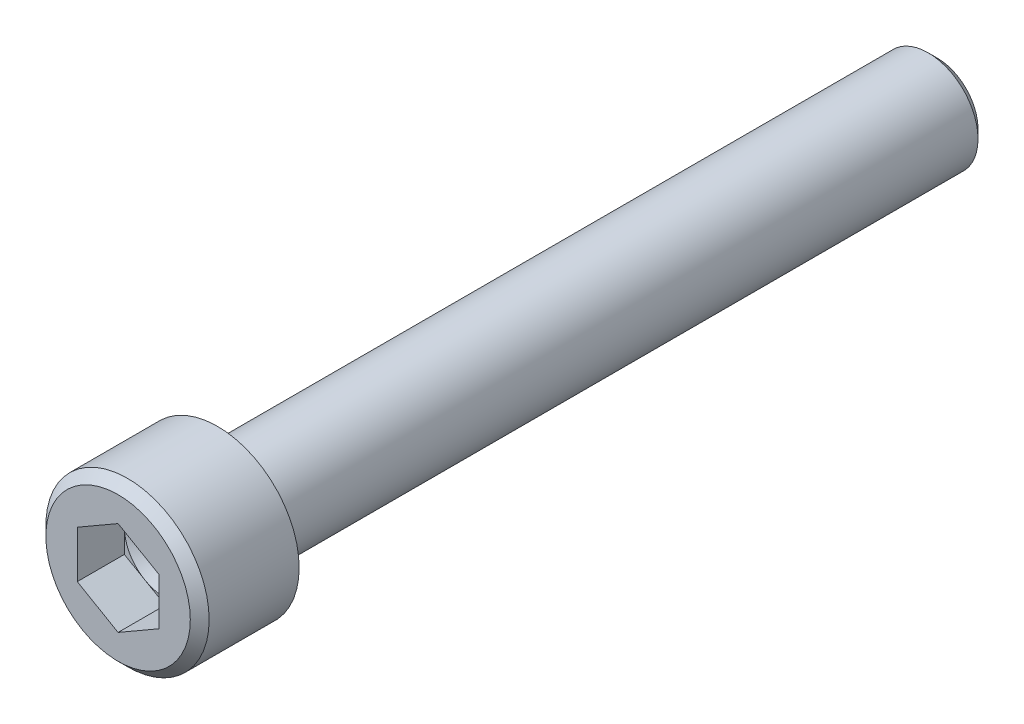
ISO-10303-21;
HEADER;
FILE_DESCRIPTION(('STEP AP214'),'2;1');
FILE_NAME('part.step','',(''),(''),'','','');
FILE_SCHEMA(('AUTOMOTIVE_DESIGN { 1 0 10303 214 1 1 1 1 }'));
ENDSEC;
DATA;
#1=APPLICATION_CONTEXT('core data for automotive mechanical design processes');
#2=APPLICATION_PROTOCOL_DEFINITION('international standard','automotive_design',2000,#1);
#3=PRODUCT_CONTEXT('',#1,'mechanical');
#4=PRODUCT('Part','Part','',(#3));
#5=PRODUCT_RELATED_PRODUCT_CATEGORY('part','',(#4));
#6=PRODUCT_DEFINITION_FORMATION('','',#4);
#7=PRODUCT_DEFINITION_CONTEXT('part definition',#1,'design');
#8=PRODUCT_DEFINITION('design','',#6,#7);
#9=PRODUCT_DEFINITION_SHAPE('','',#8);
#10=(LENGTH_UNIT() NAMED_UNIT(*) SI_UNIT(.MILLI.,.METRE.));
#11=(NAMED_UNIT(*) PLANE_ANGLE_UNIT() SI_UNIT($,.RADIAN.));
#12=(NAMED_UNIT(*) SI_UNIT($,.STERADIAN.) SOLID_ANGLE_UNIT());
#13=UNCERTAINTY_MEASURE_WITH_UNIT(LENGTH_MEASURE(1.E-05),#10,'distance_accuracy_value','');
#14=(GEOMETRIC_REPRESENTATION_CONTEXT(3) GLOBAL_UNCERTAINTY_ASSIGNED_CONTEXT((#13)) GLOBAL_UNIT_ASSIGNED_CONTEXT((#10,
#11,#12)) REPRESENTATION_CONTEXT('',''));
#15=CARTESIAN_POINT('',(0.,0.,0.));
#16=DIRECTION('',(0.,0.,1.));
#17=DIRECTION('',(1.,0.,0.));
#18=AXIS2_PLACEMENT_3D('',#15,#16,#17);
#19=CARTESIAN_POINT('',(0.,0.,2.54));
#20=DIRECTION('',(0.,0.,1.));
#21=DIRECTION('',(1.,0.,0.));
#22=AXIS2_PLACEMENT_3D('',#19,#20,#21);
#23=PLANE('',#22);
#24=DIRECTION('',(0.,1.,0.));
#25=VECTOR('',#24,1.);
#26=CARTESIAN_POINT('',(-1.9812,0.,2.54));
#27=LINE('',#26,#25);
#28=CARTESIAN_POINT('',(-1.9812,0.,2.54));
#29=VERTEX_POINT('',#28);
#30=CARTESIAN_POINT('',(-1.9812,1.14384635331848,2.54));
#31=VERTEX_POINT('',#30);
#32=EDGE_CURVE('E398',#29,#31,#27,.T.);
#33=ORIENTED_EDGE('',*,*,#32,.F.);
#34=CARTESIAN_POINT('',(0.,0.,2.54));
#35=DIRECTION('',(0.,0.,-1.));
#36=DIRECTION('',(-1.,0.,0.));
#37=AXIS2_PLACEMENT_3D('',#34,#35,#36);
#38=CIRCLE('',#37,1.9812);
#39=CARTESIAN_POINT('',(-0.9906,1.71576952997773,2.54));
#40=VERTEX_POINT('',#39);
#41=EDGE_CURVE('E33',#29,#40,#38,.T.);
#42=ORIENTED_EDGE('',*,*,#41,.T.);
#43=DIRECTION('',(0.866025403784439,0.5,0.));
#44=VECTOR('',#43,1.);
#45=CARTESIAN_POINT('',(0.163354175866616,2.38200528404682,2.54));
#46=LINE('',#45,#44);
#47=EDGE_CURVE('E393',#31,#40,#46,.T.);
#48=ORIENTED_EDGE('',*,*,#47,.F.);
#49=EDGE_LOOP('',(#33,#42,#48));
#50=FACE_BOUND('',#49,.T.);
#51=ADVANCED_FACE('F17',(#50),#23,.T.);
#52=CARTESIAN_POINT('',(0.,2.28769270663697,2.54));
#53=VERTEX_POINT('',#52);
#54=EDGE_CURVE('E391',#40,#53,#46,.T.);
#55=ORIENTED_EDGE('',*,*,#54,.F.);
#56=CARTESIAN_POINT('',(0.9906,1.71576952997773,2.54));
#57=VERTEX_POINT('',#56);
#58=EDGE_CURVE('E225',#40,#57,#38,.T.);
#59=ORIENTED_EDGE('',*,*,#58,.T.);
#60=DIRECTION('',(0.866025403784439,-0.5,0.));
#61=VECTOR('',#60,1.);
#62=CARTESIAN_POINT('',(-0.163354175866613,2.38200528404681,2.54));
#63=LINE('',#62,#61);
#64=EDGE_CURVE('E383',#53,#57,#63,.T.);
#65=ORIENTED_EDGE('',*,*,#64,.F.);
#66=EDGE_LOOP('',(#55,#59,#65));
#67=FACE_BOUND('',#66,.T.);
#68=ADVANCED_FACE('F105',(#67),#23,.T.);
#69=CARTESIAN_POINT('',(1.9812,1.14384635331849,2.54));
#70=VERTEX_POINT('',#69);
#71=EDGE_CURVE('E190',#57,#70,#63,.T.);
#72=ORIENTED_EDGE('',*,*,#71,.F.);
#73=CARTESIAN_POINT('',(1.9812,0.,2.54));
#74=VERTEX_POINT('',#73);
#75=EDGE_CURVE('E380',#57,#74,#38,.T.);
#76=ORIENTED_EDGE('',*,*,#75,.T.);
#77=DIRECTION('',(0.,-1.,0.));
#78=VECTOR('',#77,1.);
#79=CARTESIAN_POINT('',(1.9812,0.,2.54));
#80=LINE('',#79,#78);
#81=EDGE_CURVE('E160',#70,#74,#80,.T.);
#82=ORIENTED_EDGE('',*,*,#81,.F.);
#83=EDGE_LOOP('',(#72,#76,#82));
#84=FACE_BOUND('',#83,.T.);
#85=ADVANCED_FACE('F111',(#84),#23,.T.);
#86=CARTESIAN_POINT('',(1.9812,-1.14384635331849,2.54));
#87=VERTEX_POINT('',#86);
#88=EDGE_CURVE('E155',#74,#87,#80,.T.);
#89=ORIENTED_EDGE('',*,*,#88,.F.);
#90=CARTESIAN_POINT('',(0.9906,-1.71576952997773,2.54));
#91=VERTEX_POINT('',#90);
#92=EDGE_CURVE('E416',#74,#91,#38,.T.);
#93=ORIENTED_EDGE('',*,*,#92,.T.);
#94=DIRECTION('',(-0.866025403784438,-0.5,0.));
#95=VECTOR('',#94,1.);
#96=CARTESIAN_POINT('',(2.14455417586661,-1.04953377590865,2.54));
#97=LINE('',#96,#95);
#98=EDGE_CURVE('E148',#87,#91,#97,.T.);
#99=ORIENTED_EDGE('',*,*,#98,.F.);
#100=EDGE_LOOP('',(#89,#93,#99));
#101=FACE_BOUND('',#100,.T.);
#102=ADVANCED_FACE('F129',(#101),#23,.T.);
#103=CARTESIAN_POINT('',(0.,-2.28769270663697,2.54));
#104=VERTEX_POINT('',#103);
#105=EDGE_CURVE('E141',#91,#104,#97,.T.);
#106=ORIENTED_EDGE('',*,*,#105,.F.);
#107=CARTESIAN_POINT('',(-0.9906,-1.71576952997773,2.54));
#108=VERTEX_POINT('',#107);
#109=EDGE_CURVE('E143',#91,#108,#38,.T.);
#110=ORIENTED_EDGE('',*,*,#109,.T.);
#111=DIRECTION('',(-0.866025403784439,0.5,0.));
#112=VECTOR('',#111,1.);
#113=CARTESIAN_POINT('',(-2.14455417586661,-1.04953377590865,2.54));
#114=LINE('',#113,#112);
#115=EDGE_CURVE('E145',#104,#108,#114,.T.);
#116=ORIENTED_EDGE('',*,*,#115,.F.);
#117=EDGE_LOOP('',(#106,#110,#116));
#118=FACE_BOUND('',#117,.T.);
#119=ADVANCED_FACE('F119',(#118),#23,.T.);
#120=CARTESIAN_POINT('',(0.,0.,4.826));
#121=DIRECTION('',(0.,0.,1.));
#122=DIRECTION('',(1.,0.,0.));
#123=AXIS2_PLACEMENT_3D('',#120,#121,#122);
#124=PLANE('',#123);
#125=CARTESIAN_POINT('',(0.,0.,4.826));
#126=DIRECTION('',(0.,0.,1.));
#127=DIRECTION('',(1.,0.,0.));
#128=AXIS2_PLACEMENT_3D('',#125,#126,#127);
#129=CIRCLE('',#128,3.5052);
#130=CARTESIAN_POINT('',(3.5052,0.,4.826));
#131=VERTEX_POINT('',#130);
#132=EDGE_CURVE('E211',#131,#131,#129,.T.);
#133=ORIENTED_EDGE('',*,*,#132,.T.);
#134=EDGE_LOOP('',(#133));
#135=FACE_BOUND('',#134,.T.);
#136=DIRECTION('',(0.866025403784439,0.5,0.));
#137=VECTOR('',#136,1.);
#138=CARTESIAN_POINT('',(0.163354175866616,2.38200528404682,4.826));
#139=LINE('',#138,#137);
#140=CARTESIAN_POINT('',(-1.9812,1.14384635331848,4.826));
#141=VERTEX_POINT('',#140);
#142=CARTESIAN_POINT('',(0.,2.28769270663697,4.826));
#143=VERTEX_POINT('',#142);
#144=EDGE_CURVE('E172',#141,#143,#139,.T.);
#145=ORIENTED_EDGE('',*,*,#144,.T.);
#146=DIRECTION('',(0.866025403784439,-0.5,0.));
#147=VECTOR('',#146,1.);
#148=CARTESIAN_POINT('',(-0.163354175866613,2.38200528404681,4.826));
#149=LINE('',#148,#147);
#150=CARTESIAN_POINT('',(1.9812,1.14384635331849,4.826));
#151=VERTEX_POINT('',#150);
#152=EDGE_CURVE('E168',#143,#151,#149,.T.);
#153=ORIENTED_EDGE('',*,*,#152,.T.);
#154=DIRECTION('',(0.,-1.,0.));
#155=VECTOR('',#154,1.);
#156=CARTESIAN_POINT('',(1.9812,0.,4.826));
#157=LINE('',#156,#155);
#158=CARTESIAN_POINT('',(1.9812,-1.14384635331849,4.826));
#159=VERTEX_POINT('',#158);
#160=EDGE_CURVE('E186',#151,#159,#157,.T.);
#161=ORIENTED_EDGE('',*,*,#160,.T.);
#162=DIRECTION('',(-0.866025403784438,-0.5,0.));
#163=VECTOR('',#162,1.);
#164=CARTESIAN_POINT('',(2.14455417586661,-1.04953377590865,4.826));
#165=LINE('',#164,#163);
#166=CARTESIAN_POINT('',(0.,-2.28769270663697,4.826));
#167=VERTEX_POINT('',#166);
#168=EDGE_CURVE('E41',#159,#167,#165,.T.);
#169=ORIENTED_EDGE('',*,*,#168,.T.);
#170=DIRECTION('',(-0.866025403784439,0.5,0.));
#171=VECTOR('',#170,1.);
#172=CARTESIAN_POINT('',(-2.14455417586661,-1.04953377590865,4.826));
#173=LINE('',#172,#171);
#174=CARTESIAN_POINT('',(-1.9812,-1.14384635331849,4.826));
#175=VERTEX_POINT('',#174);
#176=EDGE_CURVE('E180',#167,#175,#173,.T.);
#177=ORIENTED_EDGE('',*,*,#176,.T.);
#178=DIRECTION('',(0.,1.,0.));
#179=VECTOR('',#178,1.);
#180=CARTESIAN_POINT('',(-1.9812,0.,4.826));
#181=LINE('',#180,#179);
#182=EDGE_CURVE('E176',#175,#141,#181,.T.);
#183=ORIENTED_EDGE('',*,*,#182,.T.);
#184=EDGE_LOOP('',(#145,#153,#161,#169,#177,#183));
#185=FACE_BOUND('',#184,.T.);
#186=ADVANCED_FACE('F128',(#135,#185),#124,.T.);
#187=CARTESIAN_POINT('',(0.,0.,4.826));
#188=DIRECTION('',(0.,0.,-1.));
#189=DIRECTION('',(-1.,0.,0.));
#190=AXIS2_PLACEMENT_3D('',#187,#188,#189);
#191=CYLINDRICAL_SURFACE('',#190,3.9624);
#192=CARTESIAN_POINT('',(0.,0.,4.3688));
#193=DIRECTION('',(0.,0.,1.));
#194=DIRECTION('',(1.,0.,0.));
#195=AXIS2_PLACEMENT_3D('',#192,#193,#194);
#196=CIRCLE('',#195,3.9624);
#197=CARTESIAN_POINT('',(3.9624,0.,4.3688));
#198=VERTEX_POINT('',#197);
#199=EDGE_CURVE('E215',#198,#198,#196,.F.);
#200=ORIENTED_EDGE('',*,*,#199,.T.);
#201=EDGE_LOOP('',(#200));
#202=FACE_BOUND('',#201,.T.);
#203=CARTESIAN_POINT('',(0.,0.,0.));
#204=DIRECTION('',(0.,0.,1.));
#205=DIRECTION('',(1.,0.,0.));
#206=AXIS2_PLACEMENT_3D('',#203,#204,#205);
#207=CIRCLE('',#206,3.9624);
#208=CARTESIAN_POINT('',(3.9624,0.,0.));
#209=VERTEX_POINT('',#208);
#210=EDGE_CURVE('E207',#209,#209,#207,.T.);
#211=ORIENTED_EDGE('',*,*,#210,.T.);
#212=EDGE_LOOP('',(#211));
#213=FACE_BOUND('',#212,.T.);
#214=ADVANCED_FACE('F134',(#202,#213),#191,.T.);
#215=CARTESIAN_POINT('',(0.,0.,0.));
#216=DIRECTION('',(0.,0.,1.));
#217=DIRECTION('',(1.,0.,0.));
#218=AXIS2_PLACEMENT_3D('',#215,#216,#217);
#219=PLANE('',#218);
#220=CARTESIAN_POINT('',(0.,0.,0.));
#221=DIRECTION('',(0.,0.,1.));
#222=DIRECTION('',(1.,0.,0.));
#223=AXIS2_PLACEMENT_3D('',#220,#221,#222);
#224=CIRCLE('',#223,2.5654);
#225=CARTESIAN_POINT('',(2.5654,0.,0.));
#226=VERTEX_POINT('',#225);
#227=EDGE_CURVE('E224',#226,#226,#224,.T.);
#228=ORIENTED_EDGE('',*,*,#227,.T.);
#229=EDGE_LOOP('',(#228));
#230=FACE_BOUND('',#229,.T.);
#231=ORIENTED_EDGE('',*,*,#210,.F.);
#232=EDGE_LOOP('',(#231));
#233=FACE_BOUND('',#232,.T.);
#234=ADVANCED_FACE('F324',(#230,#233),#219,.F.);
#235=CARTESIAN_POINT('',(0.,0.,4.826));
#236=DIRECTION('',(0.,0.,-1.));
#237=DIRECTION('',(-1.,0.,0.));
#238=AXIS2_PLACEMENT_3D('',#235,#236,#237);
#239=CONICAL_SURFACE('',#238,3.5052,0.785398163397449);
#240=ORIENTED_EDGE('',*,*,#199,.F.);
#241=EDGE_LOOP('',(#240));
#242=FACE_BOUND('',#241,.T.);
#243=ORIENTED_EDGE('',*,*,#132,.F.);
#244=EDGE_LOOP('',(#243));
#245=FACE_BOUND('',#244,.T.);
#246=ADVANCED_FACE('F315',(#242,#245),#239,.T.);
#247=CARTESIAN_POINT('',(-0.163354175866613,2.38200528404681,2.54));
#248=DIRECTION('',(-0.5,-0.866025403784439,0.));
#249=DIRECTION('',(0.866025403784439,-0.5,0.));
#250=AXIS2_PLACEMENT_3D('',#247,#248,#249);
#251=PLANE('',#250);
#252=ORIENTED_EDGE('',*,*,#152,.F.);
#253=DIRECTION('',(0.,0.,1.));
#254=VECTOR('',#253,1.);
#255=CARTESIAN_POINT('',(0.,2.28769270663697,2.54));
#256=LINE('',#255,#254);
#257=EDGE_CURVE('E204',#53,#143,#256,.T.);
#258=ORIENTED_EDGE('',*,*,#257,.F.);
#259=ORIENTED_EDGE('',*,*,#64,.T.);
#260=ORIENTED_EDGE('',*,*,#71,.T.);
#261=DIRECTION('',(0.,0.,1.));
#262=VECTOR('',#261,1.);
#263=CARTESIAN_POINT('',(1.9812,1.14384635331849,2.54));
#264=LINE('',#263,#262);
#265=EDGE_CURVE('E167',#70,#151,#264,.T.);
#266=ORIENTED_EDGE('',*,*,#265,.T.);
#267=EDGE_LOOP('',(#252,#258,#259,#260,#266));
#268=FACE_BOUND('',#267,.T.);
#269=ADVANCED_FACE('F306',(#268),#251,.T.);
#270=CARTESIAN_POINT('',(0.163354175866616,2.38200528404682,2.54));
#271=DIRECTION('',(0.5,-0.866025403784438,0.));
#272=DIRECTION('',(0.866025403784438,0.5,0.));
#273=AXIS2_PLACEMENT_3D('',#270,#271,#272);
#274=PLANE('',#273);
#275=ORIENTED_EDGE('',*,*,#144,.F.);
#276=DIRECTION('',(0.,0.,1.));
#277=VECTOR('',#276,1.);
#278=CARTESIAN_POINT('',(-1.9812,1.14384635331848,2.54));
#279=LINE('',#278,#277);
#280=EDGE_CURVE('E201',#31,#141,#279,.T.);
#281=ORIENTED_EDGE('',*,*,#280,.F.);
#282=ORIENTED_EDGE('',*,*,#47,.T.);
#283=ORIENTED_EDGE('',*,*,#54,.T.);
#284=ORIENTED_EDGE('',*,*,#257,.T.);
#285=EDGE_LOOP('',(#275,#281,#282,#283,#284));
#286=FACE_BOUND('',#285,.T.);
#287=ADVANCED_FACE('F297',(#286),#274,.T.);
#288=CARTESIAN_POINT('',(-1.9812,0.,2.54));
#289=DIRECTION('',(1.,0.,0.));
#290=DIRECTION('',(0.,1.,0.));
#291=AXIS2_PLACEMENT_3D('',#288,#289,#290);
#292=PLANE('',#291);
#293=ORIENTED_EDGE('',*,*,#182,.F.);
#294=DIRECTION('',(0.,0.,1.));
#295=VECTOR('',#294,1.);
#296=CARTESIAN_POINT('',(-1.9812,-1.14384635331849,2.54));
#297=LINE('',#296,#295);
#298=CARTESIAN_POINT('',(-1.9812,-1.14384635331849,2.54));
#299=VERTEX_POINT('',#298);
#300=EDGE_CURVE('E198',#299,#175,#297,.T.);
#301=ORIENTED_EDGE('',*,*,#300,.F.);
#302=EDGE_CURVE('E399',#299,#29,#27,.T.);
#303=ORIENTED_EDGE('',*,*,#302,.T.);
#304=ORIENTED_EDGE('',*,*,#32,.T.);
#305=ORIENTED_EDGE('',*,*,#280,.T.);
#306=EDGE_LOOP('',(#293,#301,#303,#304,#305));
#307=FACE_BOUND('',#306,.T.);
#308=ADVANCED_FACE('F288',(#307),#292,.T.);
#309=CARTESIAN_POINT('',(-2.14455417586661,-1.04953377590865,2.54));
#310=DIRECTION('',(0.5,0.866025403784439,0.));
#311=DIRECTION('',(-0.866025403784439,0.5,0.));
#312=AXIS2_PLACEMENT_3D('',#309,#310,#311);
#313=PLANE('',#312);
#314=ORIENTED_EDGE('',*,*,#176,.F.);
#315=DIRECTION('',(0.,0.,1.));
#316=VECTOR('',#315,1.);
#317=CARTESIAN_POINT('',(0.,-2.28769270663697,2.54));
#318=LINE('',#317,#316);
#319=EDGE_CURVE('E195',#104,#167,#318,.T.);
#320=ORIENTED_EDGE('',*,*,#319,.F.);
#321=ORIENTED_EDGE('',*,*,#115,.T.);
#322=EDGE_CURVE('E401',#108,#299,#114,.T.);
#323=ORIENTED_EDGE('',*,*,#322,.T.);
#324=ORIENTED_EDGE('',*,*,#300,.T.);
#325=EDGE_LOOP('',(#314,#320,#321,#323,#324));
#326=FACE_BOUND('',#325,.T.);
#327=ADVANCED_FACE('F280',(#326),#313,.T.);
#328=CARTESIAN_POINT('',(2.14455417586661,-1.04953377590865,2.54));
#329=DIRECTION('',(-0.5,0.866025403784438,0.));
#330=DIRECTION('',(-0.866025403784438,-0.5,0.));
#331=AXIS2_PLACEMENT_3D('',#328,#329,#330);
#332=PLANE('',#331);
#333=ORIENTED_EDGE('',*,*,#168,.F.);
#334=DIRECTION('',(0.,0.,1.));
#335=VECTOR('',#334,1.);
#336=CARTESIAN_POINT('',(1.9812,-1.14384635331849,2.54));
#337=LINE('',#336,#335);
#338=EDGE_CURVE('E151',#87,#159,#337,.T.);
#339=ORIENTED_EDGE('',*,*,#338,.F.);
#340=ORIENTED_EDGE('',*,*,#98,.T.);
#341=ORIENTED_EDGE('',*,*,#105,.T.);
#342=ORIENTED_EDGE('',*,*,#319,.T.);
#343=EDGE_LOOP('',(#333,#339,#340,#341,#342));
#344=FACE_BOUND('',#343,.T.);
#345=ADVANCED_FACE('F124',(#344),#332,.T.);
#346=CARTESIAN_POINT('',(1.9812,0.,2.54));
#347=DIRECTION('',(-1.,0.,0.));
#348=DIRECTION('',(0.,-1.,0.));
#349=AXIS2_PLACEMENT_3D('',#346,#347,#348);
#350=PLANE('',#349);
#351=ORIENTED_EDGE('',*,*,#160,.F.);
#352=ORIENTED_EDGE('',*,*,#265,.F.);
#353=ORIENTED_EDGE('',*,*,#81,.T.);
#354=ORIENTED_EDGE('',*,*,#88,.T.);
#355=ORIENTED_EDGE('',*,*,#338,.T.);
#356=EDGE_LOOP('',(#351,#352,#353,#354,#355));
#357=FACE_BOUND('',#356,.T.);
#358=ADVANCED_FACE('F117',(#357),#350,.T.);
#359=ORIENTED_EDGE('',*,*,#322,.F.);
#360=EDGE_CURVE('E219',#108,#29,#38,.T.);
#361=ORIENTED_EDGE('',*,*,#360,.T.);
#362=ORIENTED_EDGE('',*,*,#302,.F.);
#363=EDGE_LOOP('',(#359,#361,#362));
#364=FACE_BOUND('',#363,.T.);
#365=ADVANCED_FACE('F108',(#364),#23,.T.);
#366=CARTESIAN_POINT('',(0.,0.,-34.925));
#367=DIRECTION('',(0.,0.,1.));
#368=DIRECTION('',(1.,0.,0.));
#369=AXIS2_PLACEMENT_3D('',#366,#367,#368);
#370=CYLINDRICAL_SURFACE('',#369,2.413);
#371=CARTESIAN_POINT('',(0.,0.,-34.49605761938));
#372=DIRECTION('',(0.,0.,-1.));
#373=DIRECTION('',(-1.,0.,0.));
#374=AXIS2_PLACEMENT_3D('',#371,#372,#373);
#375=CIRCLE('',#374,2.413);
#376=CARTESIAN_POINT('',(-2.413,0.,-34.49605761938));
#377=VERTEX_POINT('',#376);
#378=EDGE_CURVE('E11',#377,#377,#375,.F.);
#379=ORIENTED_EDGE('',*,*,#378,.T.);
#380=EDGE_LOOP('',(#379));
#381=FACE_BOUND('',#380,.T.);
#382=CARTESIAN_POINT('',(0.,0.,-0.152399999999997));
#383=DIRECTION('',(0.,0.,1.));
#384=DIRECTION('',(1.,0.,0.));
#385=AXIS2_PLACEMENT_3D('',#382,#383,#384);
#386=CIRCLE('',#385,2.413);
#387=CARTESIAN_POINT('',(2.413,0.,-0.152399999999997));
#388=VERTEX_POINT('',#387);
#389=EDGE_CURVE('E220',#388,#388,#386,.F.);
#390=ORIENTED_EDGE('',*,*,#389,.T.);
#391=EDGE_LOOP('',(#390));
#392=FACE_BOUND('',#391,.T.);
#393=ADVANCED_FACE('F101',(#381,#392),#370,.T.);
#394=CARTESIAN_POINT('',(0.,0.,-34.925));
#395=DIRECTION('',(0.,0.,-1.));
#396=DIRECTION('',(1.,0.,0.));
#397=AXIS2_PLACEMENT_3D('',#394,#395,#396);
#398=PLANE('',#397);
#399=CARTESIAN_POINT('',(0.,0.,-34.925));
#400=DIRECTION('',(0.,0.,-1.));
#401=DIRECTION('',(-1.,0.,0.));
#402=AXIS2_PLACEMENT_3D('',#399,#400,#401);
#403=CIRCLE('',#402,1.98405761938);
#404=CARTESIAN_POINT('',(-1.98405761938,0.,-34.925));
#405=VERTEX_POINT('',#404);
#406=EDGE_CURVE('E26',#405,#405,#403,.T.);
#407=ORIENTED_EDGE('',*,*,#406,.T.);
#408=EDGE_LOOP('',(#407));
#409=FACE_BOUND('',#408,.T.);
#410=ADVANCED_FACE('F94',(#409),#398,.T.);
#411=CARTESIAN_POINT('',(0.,0.,1.39615364668151));
#412=DIRECTION('',(0.,0.,1.));
#413=DIRECTION('',(1.,0.,0.));
#414=AXIS2_PLACEMENT_3D('',#411,#412,#413);
#415=CONICAL_SURFACE('',#414,0.,1.0471975511966);
#416=ORIENTED_EDGE('',*,*,#41,.F.);
#417=ORIENTED_EDGE('',*,*,#360,.F.);
#418=ORIENTED_EDGE('',*,*,#109,.F.);
#419=ORIENTED_EDGE('',*,*,#92,.F.);
#420=ORIENTED_EDGE('',*,*,#75,.F.);
#421=ORIENTED_EDGE('',*,*,#58,.F.);
#422=EDGE_LOOP('',(#416,#417,#418,#419,#420,#421));
#423=FACE_BOUND('',#422,.T.);
#424=CARTESIAN_POINT('',(0.,0.,1.39615364668151));
#425=VERTEX_POINT('',#424);
#426=VERTEX_LOOP('',#425);
#427=FACE_BOUND('',#426,.T.);
#428=ADVANCED_FACE('F91',(#423,#427),#415,.F.);
#429=CARTESIAN_POINT('',(0.,0.,-0.152399999999997));
#430=DIRECTION('',(0.,0.,1.));
#431=DIRECTION('',(1.,0.,0.));
#432=AXIS2_PLACEMENT_3D('',#429,#430,#431);
#433=TOROIDAL_SURFACE('',#432,2.5654,0.1524);
#434=ORIENTED_EDGE('',*,*,#227,.F.);
#435=EDGE_LOOP('',(#434));
#436=FACE_BOUND('',#435,.T.);
#437=ORIENTED_EDGE('',*,*,#389,.F.);
#438=EDGE_LOOP('',(#437));
#439=FACE_BOUND('',#438,.T.);
#440=ADVANCED_FACE('F93',(#436,#439),#433,.F.);
#441=CARTESIAN_POINT('',(0.,0.,-34.925));
#442=DIRECTION('',(0.,0.,1.));
#443=DIRECTION('',(1.,0.,0.));
#444=AXIS2_PLACEMENT_3D('',#441,#442,#443);
#445=CONICAL_SURFACE('',#444,1.98405761938,0.785398163397445);
#446=ORIENTED_EDGE('',*,*,#378,.F.);
#447=EDGE_LOOP('',(#446));
#448=FACE_BOUND('',#447,.T.);
#449=ORIENTED_EDGE('',*,*,#406,.F.);
#450=EDGE_LOOP('',(#449));
#451=FACE_BOUND('',#450,.T.);
#452=ADVANCED_FACE('F19',(#448,#451),#445,.T.);
#453=CLOSED_SHELL('',(#51,#68,#85,#102,#119,#186,#214,#234,#246,#269,#287,#308,#327,#345,#358,
#365,#393,#410,#428,#440,#452));
#454=MANIFOLD_SOLID_BREP('B1',#453);
#455=ADVANCED_BREP_SHAPE_REPRESENTATION('',(#18,#454),#14);
#456=SHAPE_DEFINITION_REPRESENTATION(#9,#455);
ENDSEC;
END-ISO-10303-21;
